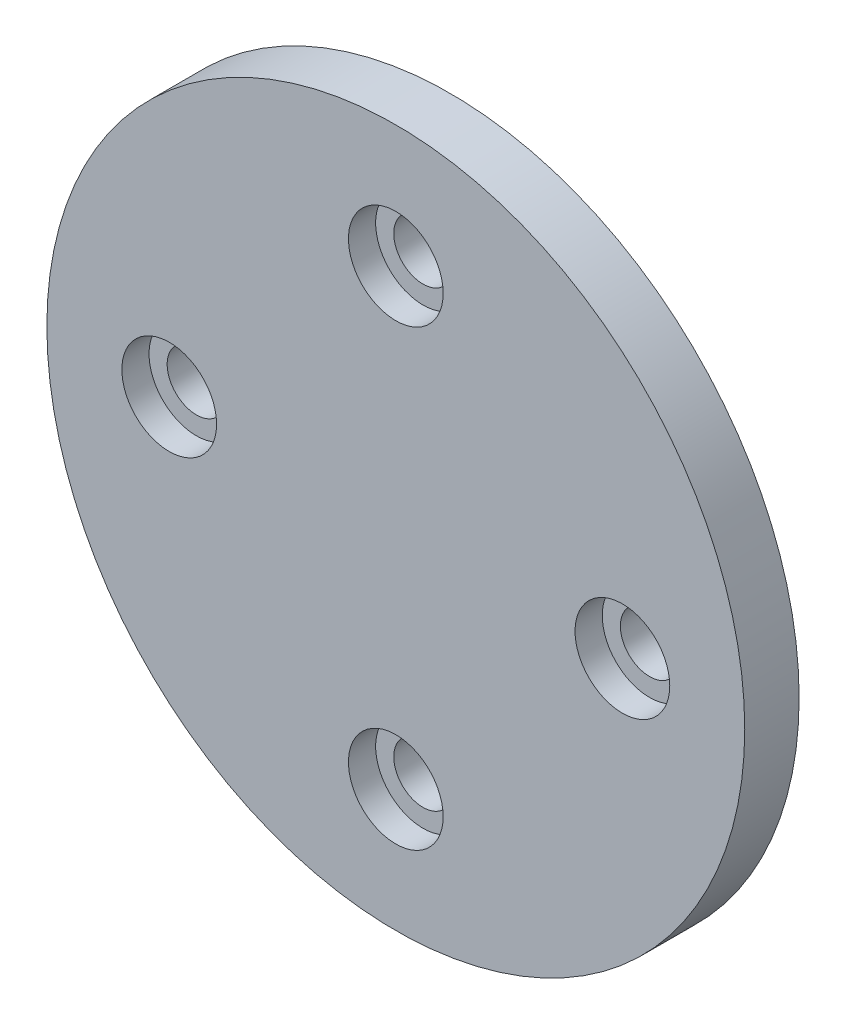
ISO-10303-21;
HEADER;
FILE_DESCRIPTION(('STEP AP214'),'2;1');
FILE_NAME('part.step','',(''),(''),'','','');
FILE_SCHEMA(('AUTOMOTIVE_DESIGN { 1 0 10303 214 1 1 1 1 }'));
ENDSEC;
DATA;
#1=APPLICATION_CONTEXT('core data for automotive mechanical design processes');
#2=APPLICATION_PROTOCOL_DEFINITION('international standard','automotive_design',2000,#1);
#3=PRODUCT_CONTEXT('',#1,'mechanical');
#4=PRODUCT('Part','Part','',(#3));
#5=PRODUCT_RELATED_PRODUCT_CATEGORY('part','',(#4));
#6=PRODUCT_DEFINITION_FORMATION('','',#4);
#7=PRODUCT_DEFINITION_CONTEXT('part definition',#1,'design');
#8=PRODUCT_DEFINITION('design','',#6,#7);
#9=PRODUCT_DEFINITION_SHAPE('','',#8);
#10=(LENGTH_UNIT() NAMED_UNIT(*) SI_UNIT(.MILLI.,.METRE.));
#11=(NAMED_UNIT(*) PLANE_ANGLE_UNIT() SI_UNIT($,.RADIAN.));
#12=(NAMED_UNIT(*) SI_UNIT($,.STERADIAN.) SOLID_ANGLE_UNIT());
#13=UNCERTAINTY_MEASURE_WITH_UNIT(LENGTH_MEASURE(1.E-05),#10,'distance_accuracy_value','');
#14=(GEOMETRIC_REPRESENTATION_CONTEXT(3) GLOBAL_UNCERTAINTY_ASSIGNED_CONTEXT((#13)) GLOBAL_UNIT_ASSIGNED_CONTEXT((#10,
#11,#12)) REPRESENTATION_CONTEXT('',''));
#15=CARTESIAN_POINT('',(0.,0.,0.));
#16=DIRECTION('',(0.,0.,1.));
#17=DIRECTION('',(1.,0.,0.));
#18=AXIS2_PLACEMENT_3D('',#15,#16,#17);
#19=CARTESIAN_POINT('',(25.,0.,6.));
#20=DIRECTION('',(0.,0.,-1.));
#21=DIRECTION('',(-1.,0.,0.));
#22=AXIS2_PLACEMENT_3D('',#19,#20,#21);
#23=CYLINDRICAL_SURFACE('',#22,3.225);
#24=CARTESIAN_POINT('',(25.,0.,0.));
#25=DIRECTION('',(0.,0.,1.));
#26=DIRECTION('',(1.,0.,0.));
#27=AXIS2_PLACEMENT_3D('',#24,#25,#26);
#28=CIRCLE('',#27,3.225);
#29=CARTESIAN_POINT('',(28.225,0.,0.));
#30=VERTEX_POINT('',#29);
#31=EDGE_CURVE('E52',#30,#30,#28,.T.);
#32=ORIENTED_EDGE('',*,*,#31,.F.);
#33=EDGE_LOOP('',(#32));
#34=FACE_BOUND('',#33,.T.);
#35=CARTESIAN_POINT('',(25.,0.,3.));
#36=DIRECTION('',(0.,0.,1.));
#37=DIRECTION('',(1.,0.,0.));
#38=AXIS2_PLACEMENT_3D('',#35,#36,#37);
#39=CIRCLE('',#38,3.225);
#40=CARTESIAN_POINT('',(28.225,0.,3.));
#41=VERTEX_POINT('',#40);
#42=EDGE_CURVE('E35',#41,#41,#39,.T.);
#43=ORIENTED_EDGE('',*,*,#42,.T.);
#44=EDGE_LOOP('',(#43));
#45=FACE_BOUND('',#44,.T.);
#46=ADVANCED_FACE('F31',(#34,#45),#23,.F.);
#47=CARTESIAN_POINT('',(0.,25.,6.));
#48=DIRECTION('',(0.,0.,-1.));
#49=DIRECTION('',(-1.,0.,0.));
#50=AXIS2_PLACEMENT_3D('',#47,#48,#49);
#51=CYLINDRICAL_SURFACE('',#50,3.225);
#52=CARTESIAN_POINT('',(0.,25.,0.));
#53=DIRECTION('',(0.,0.,1.));
#54=DIRECTION('',(1.,0.,0.));
#55=AXIS2_PLACEMENT_3D('',#52,#53,#54);
#56=CIRCLE('',#55,3.225);
#57=CARTESIAN_POINT('',(3.22499999999999,25.,0.));
#58=VERTEX_POINT('',#57);
#59=EDGE_CURVE('E85',#58,#58,#56,.T.);
#60=ORIENTED_EDGE('',*,*,#59,.F.);
#61=EDGE_LOOP('',(#60));
#62=FACE_BOUND('',#61,.T.);
#63=CARTESIAN_POINT('',(0.,25.,3.));
#64=DIRECTION('',(0.,0.,1.));
#65=DIRECTION('',(1.,0.,0.));
#66=AXIS2_PLACEMENT_3D('',#63,#64,#65);
#67=CIRCLE('',#66,3.225);
#68=CARTESIAN_POINT('',(3.22499999999999,25.,3.));
#69=VERTEX_POINT('',#68);
#70=EDGE_CURVE('E58',#69,#69,#67,.T.);
#71=ORIENTED_EDGE('',*,*,#70,.T.);
#72=EDGE_LOOP('',(#71));
#73=FACE_BOUND('',#72,.T.);
#74=ADVANCED_FACE('F128',(#62,#73),#51,.F.);
#75=CARTESIAN_POINT('',(-25.,0.,6.));
#76=DIRECTION('',(0.,0.,-1.));
#77=DIRECTION('',(-1.,0.,0.));
#78=AXIS2_PLACEMENT_3D('',#75,#76,#77);
#79=CYLINDRICAL_SURFACE('',#78,3.225);
#80=CARTESIAN_POINT('',(-25.,0.,0.));
#81=DIRECTION('',(0.,0.,1.));
#82=DIRECTION('',(1.,0.,0.));
#83=AXIS2_PLACEMENT_3D('',#80,#81,#82);
#84=CIRCLE('',#83,3.225);
#85=CARTESIAN_POINT('',(-21.775,0.,0.));
#86=VERTEX_POINT('',#85);
#87=EDGE_CURVE('E87',#86,#86,#84,.T.);
#88=ORIENTED_EDGE('',*,*,#87,.F.);
#89=EDGE_LOOP('',(#88));
#90=FACE_BOUND('',#89,.T.);
#91=CARTESIAN_POINT('',(-25.,0.,3.));
#92=DIRECTION('',(0.,0.,1.));
#93=DIRECTION('',(1.,0.,0.));
#94=AXIS2_PLACEMENT_3D('',#91,#92,#93);
#95=CIRCLE('',#94,3.225);
#96=CARTESIAN_POINT('',(-21.775,0.,3.));
#97=VERTEX_POINT('',#96);
#98=EDGE_CURVE('E54',#97,#97,#95,.T.);
#99=ORIENTED_EDGE('',*,*,#98,.T.);
#100=EDGE_LOOP('',(#99));
#101=FACE_BOUND('',#100,.T.);
#102=ADVANCED_FACE('F101',(#90,#101),#79,.F.);
#103=CARTESIAN_POINT('',(0.,-25.,6.));
#104=DIRECTION('',(0.,0.,-1.));
#105=DIRECTION('',(-1.,0.,0.));
#106=AXIS2_PLACEMENT_3D('',#103,#104,#105);
#107=CYLINDRICAL_SURFACE('',#106,3.225);
#108=CARTESIAN_POINT('',(0.,-25.,0.));
#109=DIRECTION('',(0.,0.,1.));
#110=DIRECTION('',(1.,0.,0.));
#111=AXIS2_PLACEMENT_3D('',#108,#109,#110);
#112=CIRCLE('',#111,3.225);
#113=CARTESIAN_POINT('',(3.22500000000001,-25.,0.));
#114=VERTEX_POINT('',#113);
#115=EDGE_CURVE('E44',#114,#114,#112,.T.);
#116=ORIENTED_EDGE('',*,*,#115,.F.);
#117=EDGE_LOOP('',(#116));
#118=FACE_BOUND('',#117,.T.);
#119=CARTESIAN_POINT('',(0.,-25.,3.));
#120=DIRECTION('',(0.,0.,1.));
#121=DIRECTION('',(1.,0.,0.));
#122=AXIS2_PLACEMENT_3D('',#119,#120,#121);
#123=CIRCLE('',#122,3.225);
#124=CARTESIAN_POINT('',(3.22500000000001,-25.,3.));
#125=VERTEX_POINT('',#124);
#126=EDGE_CURVE('E49',#125,#125,#123,.T.);
#127=ORIENTED_EDGE('',*,*,#126,.T.);
#128=EDGE_LOOP('',(#127));
#129=FACE_BOUND('',#128,.T.);
#130=ADVANCED_FACE('F97',(#118,#129),#107,.F.);
#131=CARTESIAN_POINT('',(0.,0.,6.));
#132=DIRECTION('',(0.,0.,1.));
#133=DIRECTION('',(1.,0.,0.));
#134=AXIS2_PLACEMENT_3D('',#131,#132,#133);
#135=PLANE('',#134);
#136=CARTESIAN_POINT('',(25.,0.,6.));
#137=DIRECTION('',(0.,0.,1.));
#138=DIRECTION('',(1.,0.,0.));
#139=AXIS2_PLACEMENT_3D('',#136,#137,#138);
#140=CIRCLE('',#139,5.225);
#141=CARTESIAN_POINT('',(30.225,0.,6.));
#142=VERTEX_POINT('',#141);
#143=EDGE_CURVE('E74',#142,#142,#140,.T.);
#144=ORIENTED_EDGE('',*,*,#143,.F.);
#145=EDGE_LOOP('',(#144));
#146=FACE_BOUND('',#145,.T.);
#147=CARTESIAN_POINT('',(0.,25.,6.));
#148=DIRECTION('',(0.,0.,1.));
#149=DIRECTION('',(1.,0.,0.));
#150=AXIS2_PLACEMENT_3D('',#147,#148,#149);
#151=CIRCLE('',#150,5.225);
#152=CARTESIAN_POINT('',(5.22499999999999,25.,6.));
#153=VERTEX_POINT('',#152);
#154=EDGE_CURVE('E67',#153,#153,#151,.T.);
#155=ORIENTED_EDGE('',*,*,#154,.F.);
#156=EDGE_LOOP('',(#155));
#157=FACE_BOUND('',#156,.T.);
#158=CARTESIAN_POINT('',(-25.,0.,6.));
#159=DIRECTION('',(0.,0.,1.));
#160=DIRECTION('',(1.,0.,0.));
#161=AXIS2_PLACEMENT_3D('',#158,#159,#160);
#162=CIRCLE('',#161,5.225);
#163=CARTESIAN_POINT('',(-19.775,0.,6.));
#164=VERTEX_POINT('',#163);
#165=EDGE_CURVE('E60',#164,#164,#162,.T.);
#166=ORIENTED_EDGE('',*,*,#165,.F.);
#167=EDGE_LOOP('',(#166));
#168=FACE_BOUND('',#167,.T.);
#169=CARTESIAN_POINT('',(0.,-25.,6.));
#170=DIRECTION('',(0.,0.,1.));
#171=DIRECTION('',(1.,0.,0.));
#172=AXIS2_PLACEMENT_3D('',#169,#170,#171);
#173=CIRCLE('',#172,5.225);
#174=CARTESIAN_POINT('',(5.22500000000001,-25.,6.));
#175=VERTEX_POINT('',#174);
#176=EDGE_CURVE('E56',#175,#175,#173,.T.);
#177=ORIENTED_EDGE('',*,*,#176,.F.);
#178=EDGE_LOOP('',(#177));
#179=FACE_BOUND('',#178,.T.);
#180=CARTESIAN_POINT('',(0.,0.,6.));
#181=DIRECTION('',(0.,0.,1.));
#182=DIRECTION('',(1.,0.,0.));
#183=AXIS2_PLACEMENT_3D('',#180,#181,#182);
#184=CIRCLE('',#183,38.5);
#185=CARTESIAN_POINT('',(38.5,0.,6.));
#186=VERTEX_POINT('',#185);
#187=EDGE_CURVE('E10',#186,#186,#184,.T.);
#188=ORIENTED_EDGE('',*,*,#187,.T.);
#189=EDGE_LOOP('',(#188));
#190=FACE_BOUND('',#189,.T.);
#191=ADVANCED_FACE('F100',(#146,#157,#168,#179,#190),#135,.T.);
#192=CARTESIAN_POINT('',(0.,0.,0.));
#193=DIRECTION('',(0.,0.,1.));
#194=DIRECTION('',(1.,0.,0.));
#195=AXIS2_PLACEMENT_3D('',#192,#193,#194);
#196=PLANE('',#195);
#197=ORIENTED_EDGE('',*,*,#59,.T.);
#198=EDGE_LOOP('',(#197));
#199=FACE_BOUND('',#198,.T.);
#200=ORIENTED_EDGE('',*,*,#115,.T.);
#201=EDGE_LOOP('',(#200));
#202=FACE_BOUND('',#201,.T.);
#203=CARTESIAN_POINT('',(0.,0.,0.));
#204=DIRECTION('',(0.,0.,1.));
#205=DIRECTION('',(1.,0.,0.));
#206=AXIS2_PLACEMENT_3D('',#203,#204,#205);
#207=CIRCLE('',#206,38.5);
#208=CARTESIAN_POINT('',(38.5,0.,0.));
#209=VERTEX_POINT('',#208);
#210=EDGE_CURVE('E39',#209,#209,#207,.T.);
#211=ORIENTED_EDGE('',*,*,#210,.F.);
#212=EDGE_LOOP('',(#211));
#213=FACE_BOUND('',#212,.T.);
#214=ORIENTED_EDGE('',*,*,#87,.T.);
#215=EDGE_LOOP('',(#214));
#216=FACE_BOUND('',#215,.T.);
#217=ORIENTED_EDGE('',*,*,#31,.T.);
#218=EDGE_LOOP('',(#217));
#219=FACE_BOUND('',#218,.T.);
#220=ADVANCED_FACE('F94',(#199,#202,#213,#216,#219),#196,.F.);
#221=CARTESIAN_POINT('',(0.,0.,6.));
#222=DIRECTION('',(0.,0.,-1.));
#223=DIRECTION('',(-1.,0.,0.));
#224=AXIS2_PLACEMENT_3D('',#221,#222,#223);
#225=CYLINDRICAL_SURFACE('',#224,38.5);
#226=ORIENTED_EDGE('',*,*,#187,.F.);
#227=EDGE_LOOP('',(#226));
#228=FACE_BOUND('',#227,.T.);
#229=ORIENTED_EDGE('',*,*,#210,.T.);
#230=EDGE_LOOP('',(#229));
#231=FACE_BOUND('',#230,.T.);
#232=ADVANCED_FACE('F33',(#228,#231),#225,.T.);
#233=CARTESIAN_POINT('',(0.,-25.,3.));
#234=DIRECTION('',(0.,0.,1.));
#235=DIRECTION('',(1.,0.,0.));
#236=AXIS2_PLACEMENT_3D('',#233,#234,#235);
#237=CYLINDRICAL_SURFACE('',#236,5.225);
#238=CARTESIAN_POINT('',(0.,-25.,3.));
#239=DIRECTION('',(0.,0.,1.));
#240=DIRECTION('',(1.,0.,0.));
#241=AXIS2_PLACEMENT_3D('',#238,#239,#240);
#242=CIRCLE('',#241,5.225);
#243=CARTESIAN_POINT('',(5.22500000000001,-25.,3.));
#244=VERTEX_POINT('',#243);
#245=EDGE_CURVE('E53',#244,#244,#242,.T.);
#246=ORIENTED_EDGE('',*,*,#245,.F.);
#247=EDGE_LOOP('',(#246));
#248=FACE_BOUND('',#247,.T.);
#249=ORIENTED_EDGE('',*,*,#176,.T.);
#250=EDGE_LOOP('',(#249));
#251=FACE_BOUND('',#250,.T.);
#252=ADVANCED_FACE('F109',(#248,#251),#237,.F.);
#253=CARTESIAN_POINT('',(0.,-25.,3.));
#254=DIRECTION('',(0.,0.,1.));
#255=DIRECTION('',(1.,0.,0.));
#256=AXIS2_PLACEMENT_3D('',#253,#254,#255);
#257=PLANE('',#256);
#258=ORIENTED_EDGE('',*,*,#126,.F.);
#259=EDGE_LOOP('',(#258));
#260=FACE_BOUND('',#259,.T.);
#261=ORIENTED_EDGE('',*,*,#245,.T.);
#262=EDGE_LOOP('',(#261));
#263=FACE_BOUND('',#262,.T.);
#264=ADVANCED_FACE('F105',(#260,#263),#257,.T.);
#265=CARTESIAN_POINT('',(-25.,0.,3.));
#266=DIRECTION('',(0.,0.,1.));
#267=DIRECTION('',(1.,0.,0.));
#268=AXIS2_PLACEMENT_3D('',#265,#266,#267);
#269=CYLINDRICAL_SURFACE('',#268,5.225);
#270=CARTESIAN_POINT('',(-25.,0.,3.));
#271=DIRECTION('',(0.,0.,1.));
#272=DIRECTION('',(1.,0.,0.));
#273=AXIS2_PLACEMENT_3D('',#270,#271,#272);
#274=CIRCLE('',#273,5.225);
#275=CARTESIAN_POINT('',(-19.775,0.,3.));
#276=VERTEX_POINT('',#275);
#277=EDGE_CURVE('E57',#276,#276,#274,.T.);
#278=ORIENTED_EDGE('',*,*,#277,.F.);
#279=EDGE_LOOP('',(#278));
#280=FACE_BOUND('',#279,.T.);
#281=ORIENTED_EDGE('',*,*,#165,.T.);
#282=EDGE_LOOP('',(#281));
#283=FACE_BOUND('',#282,.T.);
#284=ADVANCED_FACE('F108',(#280,#283),#269,.F.);
#285=CARTESIAN_POINT('',(-25.,0.,3.));
#286=DIRECTION('',(0.,0.,1.));
#287=DIRECTION('',(1.,0.,0.));
#288=AXIS2_PLACEMENT_3D('',#285,#286,#287);
#289=PLANE('',#288);
#290=ORIENTED_EDGE('',*,*,#98,.F.);
#291=EDGE_LOOP('',(#290));
#292=FACE_BOUND('',#291,.T.);
#293=ORIENTED_EDGE('',*,*,#277,.T.);
#294=EDGE_LOOP('',(#293));
#295=FACE_BOUND('',#294,.T.);
#296=ADVANCED_FACE('F146',(#292,#295),#289,.T.);
#297=CARTESIAN_POINT('',(0.,25.,3.));
#298=DIRECTION('',(0.,0.,1.));
#299=DIRECTION('',(1.,0.,0.));
#300=AXIS2_PLACEMENT_3D('',#297,#298,#299);
#301=CYLINDRICAL_SURFACE('',#300,5.225);
#302=CARTESIAN_POINT('',(0.,25.,3.));
#303=DIRECTION('',(0.,0.,1.));
#304=DIRECTION('',(1.,0.,0.));
#305=AXIS2_PLACEMENT_3D('',#302,#303,#304);
#306=CIRCLE('',#305,5.225);
#307=CARTESIAN_POINT('',(5.22499999999999,25.,3.));
#308=VERTEX_POINT('',#307);
#309=EDGE_CURVE('E61',#308,#308,#306,.T.);
#310=ORIENTED_EDGE('',*,*,#309,.F.);
#311=EDGE_LOOP('',(#310));
#312=FACE_BOUND('',#311,.T.);
#313=ORIENTED_EDGE('',*,*,#154,.T.);
#314=EDGE_LOOP('',(#313));
#315=FACE_BOUND('',#314,.T.);
#316=ADVANCED_FACE('F149',(#312,#315),#301,.F.);
#317=CARTESIAN_POINT('',(0.,25.,3.));
#318=DIRECTION('',(0.,0.,1.));
#319=DIRECTION('',(1.,0.,0.));
#320=AXIS2_PLACEMENT_3D('',#317,#318,#319);
#321=PLANE('',#320);
#322=ORIENTED_EDGE('',*,*,#70,.F.);
#323=EDGE_LOOP('',(#322));
#324=FACE_BOUND('',#323,.T.);
#325=ORIENTED_EDGE('',*,*,#309,.T.);
#326=EDGE_LOOP('',(#325));
#327=FACE_BOUND('',#326,.T.);
#328=ADVANCED_FACE('F163',(#324,#327),#321,.T.);
#329=CARTESIAN_POINT('',(25.,0.,3.));
#330=DIRECTION('',(0.,0.,1.));
#331=DIRECTION('',(1.,0.,0.));
#332=AXIS2_PLACEMENT_3D('',#329,#330,#331);
#333=CYLINDRICAL_SURFACE('',#332,5.225);
#334=CARTESIAN_POINT('',(25.,0.,3.));
#335=DIRECTION('',(0.,0.,1.));
#336=DIRECTION('',(1.,0.,0.));
#337=AXIS2_PLACEMENT_3D('',#334,#335,#336);
#338=CIRCLE('',#337,5.225);
#339=CARTESIAN_POINT('',(30.225,0.,3.));
#340=VERTEX_POINT('',#339);
#341=EDGE_CURVE('E182',#340,#340,#338,.T.);
#342=ORIENTED_EDGE('',*,*,#341,.F.);
#343=EDGE_LOOP('',(#342));
#344=FACE_BOUND('',#343,.T.);
#345=ORIENTED_EDGE('',*,*,#143,.T.);
#346=EDGE_LOOP('',(#345));
#347=FACE_BOUND('',#346,.T.);
#348=ADVANCED_FACE('F167',(#344,#347),#333,.F.);
#349=CARTESIAN_POINT('',(25.,0.,3.));
#350=DIRECTION('',(0.,0.,1.));
#351=DIRECTION('',(1.,0.,0.));
#352=AXIS2_PLACEMENT_3D('',#349,#350,#351);
#353=PLANE('',#352);
#354=ORIENTED_EDGE('',*,*,#42,.F.);
#355=EDGE_LOOP('',(#354));
#356=FACE_BOUND('',#355,.T.);
#357=ORIENTED_EDGE('',*,*,#341,.T.);
#358=EDGE_LOOP('',(#357));
#359=FACE_BOUND('',#358,.T.);
#360=ADVANCED_FACE('F171',(#356,#359),#353,.T.);
#361=CLOSED_SHELL('',(#46,#74,#102,#130,#191,#220,#232,#252,#264,#284,#296,#316,#328,#348,#360));
#362=MANIFOLD_SOLID_BREP('B2',#361);
#363=ADVANCED_BREP_SHAPE_REPRESENTATION('',(#18,#362),#14);
#364=SHAPE_DEFINITION_REPRESENTATION(#9,#363);
ENDSEC;
END-ISO-10303-21;
